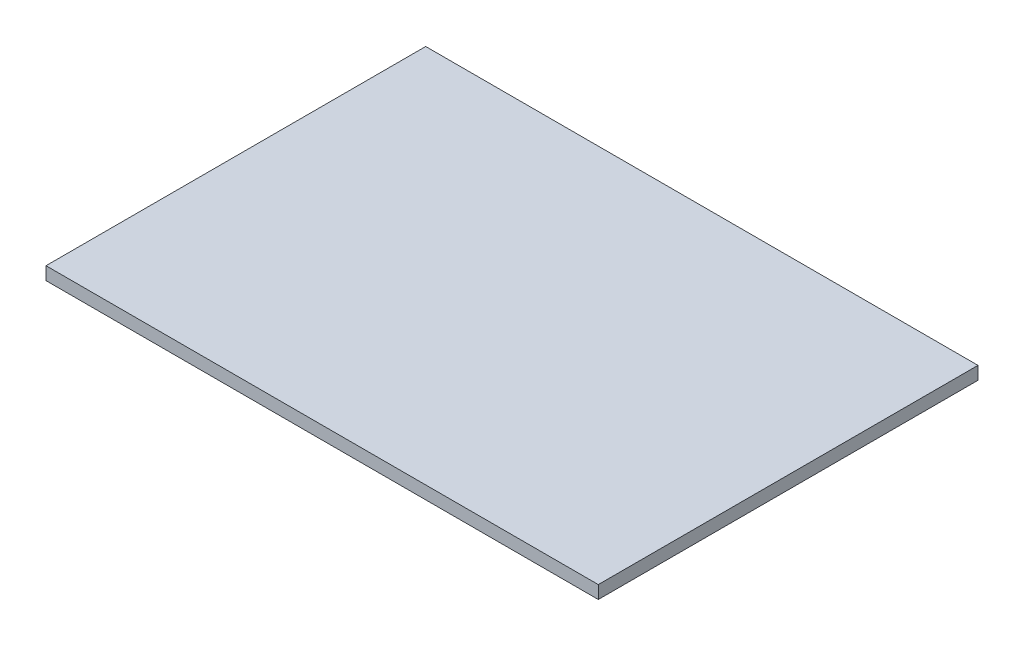
ISO-10303-21;
HEADER;
FILE_DESCRIPTION(('STEP AP214'),'2;1');
FILE_NAME('part.step','',(''),(''),'','','');
FILE_SCHEMA(('AUTOMOTIVE_DESIGN { 1 0 10303 214 1 1 1 1 }'));
ENDSEC;
DATA;
#1=APPLICATION_CONTEXT('core data for automotive mechanical design processes');
#2=APPLICATION_PROTOCOL_DEFINITION('international standard','automotive_design',2000,#1);
#3=PRODUCT_CONTEXT('',#1,'mechanical');
#4=PRODUCT('Part','Part','',(#3));
#5=PRODUCT_RELATED_PRODUCT_CATEGORY('part','',(#4));
#6=PRODUCT_DEFINITION_FORMATION('','',#4);
#7=PRODUCT_DEFINITION_CONTEXT('part definition',#1,'design');
#8=PRODUCT_DEFINITION('design','',#6,#7);
#9=PRODUCT_DEFINITION_SHAPE('','',#8);
#10=(LENGTH_UNIT() NAMED_UNIT(*) SI_UNIT(.MILLI.,.METRE.));
#11=(NAMED_UNIT(*) PLANE_ANGLE_UNIT() SI_UNIT($,.RADIAN.));
#12=(NAMED_UNIT(*) SI_UNIT($,.STERADIAN.) SOLID_ANGLE_UNIT());
#13=UNCERTAINTY_MEASURE_WITH_UNIT(LENGTH_MEASURE(1.E-05),#10,'distance_accuracy_value','');
#14=(GEOMETRIC_REPRESENTATION_CONTEXT(3) GLOBAL_UNCERTAINTY_ASSIGNED_CONTEXT((#13)) GLOBAL_UNIT_ASSIGNED_CONTEXT((#10,
#11,#12)) REPRESENTATION_CONTEXT('',''));
#15=CARTESIAN_POINT('',(0.,0.,0.));
#16=DIRECTION('',(0.,0.,1.));
#17=DIRECTION('',(1.,0.,0.));
#18=AXIS2_PLACEMENT_3D('',#15,#16,#17);
#19=CARTESIAN_POINT('',(-539.409846020386,19.05,-558.8));
#20=DIRECTION('',(1.,0.,0.));
#21=DIRECTION('',(0.,0.,-1.));
#22=AXIS2_PLACEMENT_3D('',#19,#20,#21);
#23=PLANE('',#22);
#24=DIRECTION('',(0.,0.,1.));
#25=VECTOR('',#24,1.);
#26=CARTESIAN_POINT('',(-539.409846020386,0.,-558.8));
#27=LINE('',#26,#25);
#28=CARTESIAN_POINT('',(-539.409846020386,0.,-558.8));
#29=VERTEX_POINT('',#28);
#30=CARTESIAN_POINT('',(-539.409846020386,0.,0.));
#31=VERTEX_POINT('',#30);
#32=EDGE_CURVE('E98',#29,#31,#27,.T.);
#33=ORIENTED_EDGE('',*,*,#32,.T.);
#34=DIRECTION('',(0.,-1.,0.));
#35=VECTOR('',#34,1.);
#36=CARTESIAN_POINT('',(-539.409846020386,19.05,0.));
#37=LINE('',#36,#35);
#38=CARTESIAN_POINT('',(-539.409846020386,19.05,0.));
#39=VERTEX_POINT('',#38);
#40=EDGE_CURVE('E11',#39,#31,#37,.T.);
#41=ORIENTED_EDGE('',*,*,#40,.F.);
#42=DIRECTION('',(0.,0.,1.));
#43=VECTOR('',#42,1.);
#44=CARTESIAN_POINT('',(-539.409846020386,19.05,-558.8));
#45=LINE('',#44,#43);
#46=CARTESIAN_POINT('',(-539.409846020386,19.05,-558.8));
#47=VERTEX_POINT('',#46);
#48=EDGE_CURVE('E86',#47,#39,#45,.T.);
#49=ORIENTED_EDGE('',*,*,#48,.F.);
#50=DIRECTION('',(0.,-1.,0.));
#51=VECTOR('',#50,1.);
#52=CARTESIAN_POINT('',(-539.409846020386,19.05,-558.8));
#53=LINE('',#52,#51);
#54=EDGE_CURVE('E94',#47,#29,#53,.T.);
#55=ORIENTED_EDGE('',*,*,#54,.T.);
#56=EDGE_LOOP('',(#33,#41,#49,#55));
#57=FACE_BOUND('',#56,.T.);
#58=ADVANCED_FACE('F35',(#57),#23,.F.);
#59=CARTESIAN_POINT('',(-539.409846020386,19.05,0.));
#60=DIRECTION('',(0.,0.,-1.));
#61=DIRECTION('',(-1.,0.,0.));
#62=AXIS2_PLACEMENT_3D('',#59,#60,#61);
#63=PLANE('',#62);
#64=DIRECTION('',(1.,0.,0.));
#65=VECTOR('',#64,1.);
#66=CARTESIAN_POINT('',(-539.409846020386,0.,0.));
#67=LINE('',#66,#65);
#68=CARTESIAN_POINT('',(273.390153979614,0.,0.));
#69=VERTEX_POINT('',#68);
#70=EDGE_CURVE('E90',#31,#69,#67,.T.);
#71=ORIENTED_EDGE('',*,*,#70,.T.);
#72=DIRECTION('',(0.,-1.,0.));
#73=VECTOR('',#72,1.);
#74=CARTESIAN_POINT('',(273.390153979614,19.05,0.));
#75=LINE('',#74,#73);
#76=CARTESIAN_POINT('',(273.390153979614,19.05,0.));
#77=VERTEX_POINT('',#76);
#78=EDGE_CURVE('E43',#77,#69,#75,.T.);
#79=ORIENTED_EDGE('',*,*,#78,.F.);
#80=DIRECTION('',(1.,0.,0.));
#81=VECTOR('',#80,1.);
#82=CARTESIAN_POINT('',(-539.409846020386,19.05,0.));
#83=LINE('',#82,#81);
#84=EDGE_CURVE('E81',#39,#77,#83,.T.);
#85=ORIENTED_EDGE('',*,*,#84,.F.);
#86=ORIENTED_EDGE('',*,*,#40,.T.);
#87=EDGE_LOOP('',(#71,#79,#85,#86));
#88=FACE_BOUND('',#87,.T.);
#89=ADVANCED_FACE('F89',(#88),#63,.F.);
#90=CARTESIAN_POINT('',(273.390153979614,19.05,0.));
#91=DIRECTION('',(-1.,0.,0.));
#92=DIRECTION('',(0.,0.,1.));
#93=AXIS2_PLACEMENT_3D('',#90,#91,#92);
#94=PLANE('',#93);
#95=DIRECTION('',(0.,0.,-1.));
#96=VECTOR('',#95,1.);
#97=CARTESIAN_POINT('',(273.390153979614,0.,0.));
#98=LINE('',#97,#96);
#99=CARTESIAN_POINT('',(273.390153979614,0.,-558.8));
#100=VERTEX_POINT('',#99);
#101=EDGE_CURVE('E68',#69,#100,#98,.T.);
#102=ORIENTED_EDGE('',*,*,#101,.T.);
#103=DIRECTION('',(0.,-1.,0.));
#104=VECTOR('',#103,1.);
#105=CARTESIAN_POINT('',(273.390153979614,19.05,-558.8));
#106=LINE('',#105,#104);
#107=CARTESIAN_POINT('',(273.390153979614,19.05,-558.8));
#108=VERTEX_POINT('',#107);
#109=EDGE_CURVE('E91',#108,#100,#106,.T.);
#110=ORIENTED_EDGE('',*,*,#109,.F.);
#111=DIRECTION('',(0.,0.,-1.));
#112=VECTOR('',#111,1.);
#113=CARTESIAN_POINT('',(273.390153979614,19.05,0.));
#114=LINE('',#113,#112);
#115=EDGE_CURVE('E84',#77,#108,#114,.T.);
#116=ORIENTED_EDGE('',*,*,#115,.F.);
#117=ORIENTED_EDGE('',*,*,#78,.T.);
#118=EDGE_LOOP('',(#102,#110,#116,#117));
#119=FACE_BOUND('',#118,.T.);
#120=ADVANCED_FACE('F92',(#119),#94,.F.);
#121=CARTESIAN_POINT('',(273.390153979614,19.05,-558.8));
#122=DIRECTION('',(0.,0.,1.));
#123=DIRECTION('',(1.,0.,0.));
#124=AXIS2_PLACEMENT_3D('',#121,#122,#123);
#125=PLANE('',#124);
#126=DIRECTION('',(-1.,0.,0.));
#127=VECTOR('',#126,1.);
#128=CARTESIAN_POINT('',(273.390153979614,0.,-558.8));
#129=LINE('',#128,#127);
#130=EDGE_CURVE('E74',#100,#29,#129,.T.);
#131=ORIENTED_EDGE('',*,*,#130,.T.);
#132=ORIENTED_EDGE('',*,*,#54,.F.);
#133=DIRECTION('',(-1.,0.,0.));
#134=VECTOR('',#133,1.);
#135=CARTESIAN_POINT('',(273.390153979614,19.05,-558.8));
#136=LINE('',#135,#134);
#137=EDGE_CURVE('E51',#108,#47,#136,.T.);
#138=ORIENTED_EDGE('',*,*,#137,.F.);
#139=ORIENTED_EDGE('',*,*,#109,.T.);
#140=EDGE_LOOP('',(#131,#132,#138,#139));
#141=FACE_BOUND('',#140,.T.);
#142=ADVANCED_FACE('F105',(#141),#125,.F.);
#143=CARTESIAN_POINT('',(0.,19.05,0.));
#144=DIRECTION('',(0.,1.,0.));
#145=DIRECTION('',(0.,0.,1.));
#146=AXIS2_PLACEMENT_3D('',#143,#144,#145);
#147=PLANE('',#146);
#148=ORIENTED_EDGE('',*,*,#48,.T.);
#149=ORIENTED_EDGE('',*,*,#84,.T.);
#150=ORIENTED_EDGE('',*,*,#115,.T.);
#151=ORIENTED_EDGE('',*,*,#137,.T.);
#152=EDGE_LOOP('',(#148,#149,#150,#151));
#153=FACE_BOUND('',#152,.T.);
#154=ADVANCED_FACE('F82',(#153),#147,.T.);
#155=CARTESIAN_POINT('',(0.,0.,0.));
#156=DIRECTION('',(0.,1.,0.));
#157=DIRECTION('',(0.,0.,1.));
#158=AXIS2_PLACEMENT_3D('',#155,#156,#157);
#159=PLANE('',#158);
#160=ORIENTED_EDGE('',*,*,#32,.F.);
#161=ORIENTED_EDGE('',*,*,#130,.F.);
#162=ORIENTED_EDGE('',*,*,#101,.F.);
#163=ORIENTED_EDGE('',*,*,#70,.F.);
#164=EDGE_LOOP('',(#160,#161,#162,#163));
#165=FACE_BOUND('',#164,.T.);
#166=ADVANCED_FACE('F108',(#165),#159,.F.);
#167=CLOSED_SHELL('',(#58,#89,#120,#142,#154,#166));
#168=MANIFOLD_SOLID_BREP('B2',#167);
#169=ADVANCED_BREP_SHAPE_REPRESENTATION('',(#18,#168),#14);
#170=SHAPE_DEFINITION_REPRESENTATION(#9,#169);
ENDSEC;
END-ISO-10303-21;
